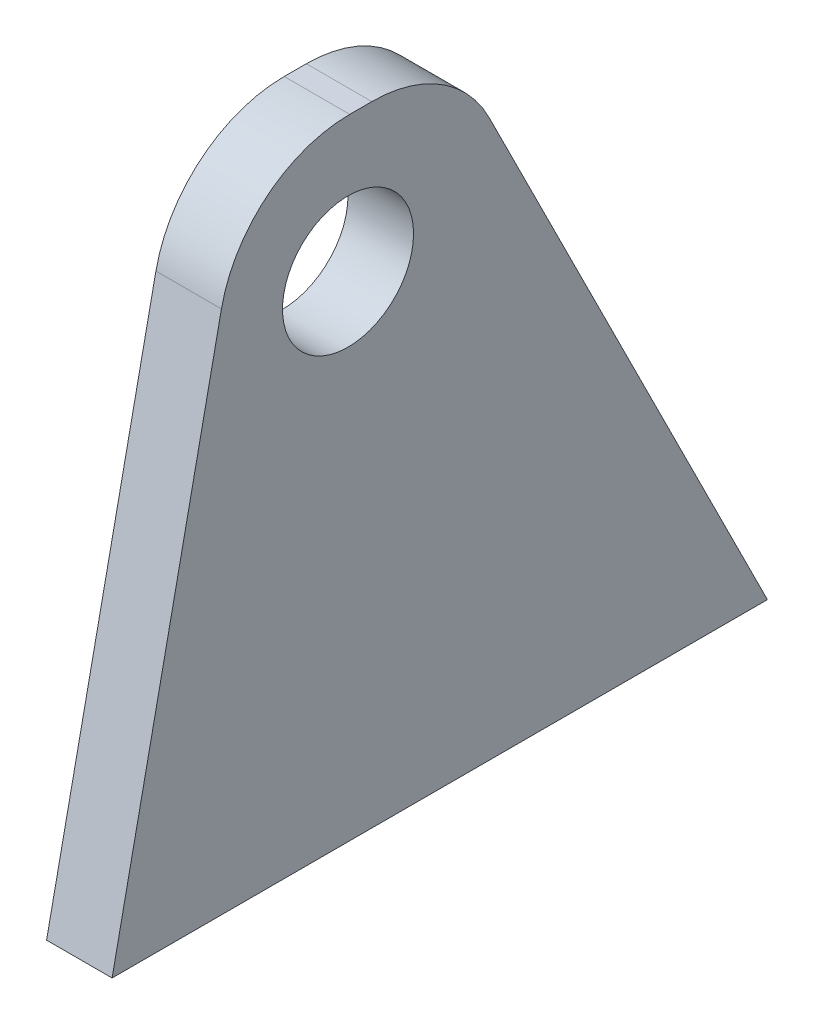
ISO-10303-21;
HEADER;
FILE_DESCRIPTION(('STEP AP214'),'2;1');
FILE_NAME('part.step','',(''),(''),'','','');
FILE_SCHEMA(('AUTOMOTIVE_DESIGN { 1 0 10303 214 1 1 1 1 }'));
ENDSEC;
DATA;
#1=APPLICATION_CONTEXT('core data for automotive mechanical design processes');
#2=APPLICATION_PROTOCOL_DEFINITION('international standard','automotive_design',2000,#1);
#3=PRODUCT_CONTEXT('',#1,'mechanical');
#4=PRODUCT('Part','Part','',(#3));
#5=PRODUCT_RELATED_PRODUCT_CATEGORY('part','',(#4));
#6=PRODUCT_DEFINITION_FORMATION('','',#4);
#7=PRODUCT_DEFINITION_CONTEXT('part definition',#1,'design');
#8=PRODUCT_DEFINITION('design','',#6,#7);
#9=PRODUCT_DEFINITION_SHAPE('','',#8);
#10=(LENGTH_UNIT() NAMED_UNIT(*) SI_UNIT(.MILLI.,.METRE.));
#11=(NAMED_UNIT(*) PLANE_ANGLE_UNIT() SI_UNIT($,.RADIAN.));
#12=(NAMED_UNIT(*) SI_UNIT($,.STERADIAN.) SOLID_ANGLE_UNIT());
#13=UNCERTAINTY_MEASURE_WITH_UNIT(LENGTH_MEASURE(1.E-05),#10,'distance_accuracy_value','');
#14=(GEOMETRIC_REPRESENTATION_CONTEXT(3) GLOBAL_UNCERTAINTY_ASSIGNED_CONTEXT((#13)) GLOBAL_UNIT_ASSIGNED_CONTEXT((#10,
#11,#12)) REPRESENTATION_CONTEXT('',''));
#15=CARTESIAN_POINT('',(0.,0.,0.));
#16=DIRECTION('',(0.,0.,1.));
#17=DIRECTION('',(1.,0.,0.));
#18=AXIS2_PLACEMENT_3D('',#15,#16,#17);
#19=CARTESIAN_POINT('',(3.175,0.,0.));
#20=DIRECTION('',(-1.,0.,0.));
#21=DIRECTION('',(0.,0.,1.));
#22=AXIS2_PLACEMENT_3D('',#19,#20,#21);
#23=PLANE('',#22);
#24=DIRECTION('',(0.,0.894427190999916,0.447213595499958));
#25=VECTOR('',#24,1.);
#26=CARTESIAN_POINT('',(3.175,0.,-31.75));
#27=LINE('',#26,#25);
#28=CARTESIAN_POINT('',(3.175,0.,-31.75));
#29=VERTEX_POINT('',#28);
#30=CARTESIAN_POINT('',(3.175,26.9698063314247,-18.2650968342876));
#31=VERTEX_POINT('',#30);
#32=EDGE_CURVE('E92',#29,#31,#27,.T.);
#33=ORIENTED_EDGE('',*,*,#32,.T.);
#34=CARTESIAN_POINT('',(3.175,24.13,-12.5854841714382));
#35=DIRECTION('',(-1.,0.,0.));
#36=DIRECTION('',(0.,0.,1.));
#37=AXIS2_PLACEMENT_3D('',#34,#35,#36);
#38=CIRCLE('',#37,6.35);
#39=CARTESIAN_POINT('',(3.175,30.48,-12.5854841714382));
#40=VERTEX_POINT('',#39);
#41=EDGE_CURVE('E47',#31,#40,#38,.F.);
#42=ORIENTED_EDGE('',*,*,#41,.T.);
#43=DIRECTION('',(0.,0.,1.));
#44=VECTOR('',#43,1.);
#45=CARTESIAN_POINT('',(3.175,30.48,-16.51));
#46=LINE('',#45,#44);
#47=CARTESIAN_POINT('',(3.175,30.48,-11.5134234806695));
#48=VERTEX_POINT('',#47);
#49=EDGE_CURVE('E99',#40,#48,#46,.T.);
#50=ORIENTED_EDGE('',*,*,#49,.T.);
#51=CARTESIAN_POINT('',(3.175,24.13,-11.5134234806695));
#52=DIRECTION('',(-1.,0.,0.));
#53=DIRECTION('',(0.,0.,1.));
#54=AXIS2_PLACEMENT_3D('',#51,#52,#53);
#55=CIRCLE('',#54,6.35);
#56=CARTESIAN_POINT('',(3.175,25.4251095136112,-5.29689781533567));
#57=VERTEX_POINT('',#56);
#58=EDGE_CURVE('E54',#48,#57,#55,.F.);
#59=ORIENTED_EDGE('',*,*,#58,.T.);
#60=DIRECTION('',(0.,-0.978980419737605,0.203954254112001));
#61=VECTOR('',#60,1.);
#62=CARTESIAN_POINT('',(3.175,30.48,-6.35));
#63=LINE('',#62,#61);
#64=CARTESIAN_POINT('',(3.175,0.,0.));
#65=VERTEX_POINT('',#64);
#66=EDGE_CURVE('E104',#57,#65,#63,.T.);
#67=ORIENTED_EDGE('',*,*,#66,.T.);
#68=DIRECTION('',(0.,0.,-1.));
#69=VECTOR('',#68,1.);
#70=CARTESIAN_POINT('',(3.175,0.,0.));
#71=LINE('',#70,#69);
#72=EDGE_CURVE('E100',#65,#29,#71,.T.);
#73=ORIENTED_EDGE('',*,*,#72,.T.);
#74=EDGE_LOOP('',(#33,#42,#50,#59,#67,#73));
#75=FACE_BOUND('',#74,.T.);
#76=CARTESIAN_POINT('',(3.175,23.92807,-11.43));
#77=DIRECTION('',(1.,0.,0.));
#78=DIRECTION('',(0.,0.,-1.));
#79=AXIS2_PLACEMENT_3D('',#76,#77,#78);
#80=CIRCLE('',#79,3.175);
#81=CARTESIAN_POINT('',(3.175,23.92807,-14.605));
#82=VERTEX_POINT('',#81);
#83=EDGE_CURVE('E145',#82,#82,#80,.T.);
#84=ORIENTED_EDGE('',*,*,#83,.F.);
#85=EDGE_LOOP('',(#84));
#86=FACE_BOUND('',#85,.T.);
#87=ADVANCED_FACE('F39',(#75,#86),#23,.F.);
#88=CARTESIAN_POINT('',(0.,0.,0.));
#89=DIRECTION('',(-1.,0.,0.));
#90=DIRECTION('',(0.,0.,1.));
#91=AXIS2_PLACEMENT_3D('',#88,#89,#90);
#92=PLANE('',#91);
#93=DIRECTION('',(0.,0.,1.));
#94=VECTOR('',#93,1.);
#95=CARTESIAN_POINT('',(0.,30.48,-16.51));
#96=LINE('',#95,#94);
#97=CARTESIAN_POINT('',(0.,30.48,-12.5854841714382));
#98=VERTEX_POINT('',#97);
#99=CARTESIAN_POINT('',(0.,30.48,-11.5134234806695));
#100=VERTEX_POINT('',#99);
#101=EDGE_CURVE('E142',#98,#100,#96,.T.);
#102=ORIENTED_EDGE('',*,*,#101,.F.);
#103=CARTESIAN_POINT('',(0.,24.13,-12.5854841714382));
#104=DIRECTION('',(-1.,0.,0.));
#105=DIRECTION('',(0.,0.,1.));
#106=AXIS2_PLACEMENT_3D('',#103,#104,#105);
#107=CIRCLE('',#106,6.35);
#108=CARTESIAN_POINT('',(0.,26.9698063314247,-18.2650968342876));
#109=VERTEX_POINT('',#108);
#110=EDGE_CURVE('E125',#98,#109,#107,.T.);
#111=ORIENTED_EDGE('',*,*,#110,.T.);
#112=DIRECTION('',(0.,0.894427190999916,0.447213595499958));
#113=VECTOR('',#112,1.);
#114=CARTESIAN_POINT('',(0.,0.,-31.75));
#115=LINE('',#114,#113);
#116=CARTESIAN_POINT('',(0.,0.,-31.75));
#117=VERTEX_POINT('',#116);
#118=EDGE_CURVE('E141',#117,#109,#115,.T.);
#119=ORIENTED_EDGE('',*,*,#118,.F.);
#120=DIRECTION('',(0.,0.,-1.));
#121=VECTOR('',#120,1.);
#122=CARTESIAN_POINT('',(0.,0.,0.));
#123=LINE('',#122,#121);
#124=CARTESIAN_POINT('',(0.,0.,0.));
#125=VERTEX_POINT('',#124);
#126=EDGE_CURVE('E112',#125,#117,#123,.T.);
#127=ORIENTED_EDGE('',*,*,#126,.F.);
#128=DIRECTION('',(0.,-0.978980419737605,0.203954254112001));
#129=VECTOR('',#128,1.);
#130=CARTESIAN_POINT('',(0.,30.48,-6.35));
#131=LINE('',#130,#129);
#132=CARTESIAN_POINT('',(0.,25.4251095136112,-5.29689781533567));
#133=VERTEX_POINT('',#132);
#134=EDGE_CURVE('E108',#133,#125,#131,.T.);
#135=ORIENTED_EDGE('',*,*,#134,.F.);
#136=CARTESIAN_POINT('',(0.,24.13,-11.5134234806695));
#137=DIRECTION('',(-1.,0.,0.));
#138=DIRECTION('',(0.,0.,1.));
#139=AXIS2_PLACEMENT_3D('',#136,#137,#138);
#140=CIRCLE('',#139,6.35);
#141=EDGE_CURVE('E123',#133,#100,#140,.T.);
#142=ORIENTED_EDGE('',*,*,#141,.T.);
#143=EDGE_LOOP('',(#102,#111,#119,#127,#135,#142));
#144=FACE_BOUND('',#143,.T.);
#145=CARTESIAN_POINT('',(0.,23.92807,-11.43));
#146=DIRECTION('',(1.,0.,0.));
#147=DIRECTION('',(0.,0.,-1.));
#148=AXIS2_PLACEMENT_3D('',#145,#146,#147);
#149=CIRCLE('',#148,3.175);
#150=CARTESIAN_POINT('',(0.,23.92807,-14.605));
#151=VERTEX_POINT('',#150);
#152=EDGE_CURVE('E230',#151,#151,#149,.T.);
#153=ORIENTED_EDGE('',*,*,#152,.T.);
#154=EDGE_LOOP('',(#153));
#155=FACE_BOUND('',#154,.T.);
#156=ADVANCED_FACE('F139',(#144,#155),#92,.T.);
#157=CARTESIAN_POINT('',(3.175,0.,0.));
#158=DIRECTION('',(0.,1.,0.));
#159=DIRECTION('',(0.,0.,1.));
#160=AXIS2_PLACEMENT_3D('',#157,#158,#159);
#161=PLANE('',#160);
#162=ORIENTED_EDGE('',*,*,#126,.T.);
#163=DIRECTION('',(-1.,0.,0.));
#164=VECTOR('',#163,1.);
#165=CARTESIAN_POINT('',(3.175,0.,-31.75));
#166=LINE('',#165,#164);
#167=EDGE_CURVE('E96',#29,#117,#166,.T.);
#168=ORIENTED_EDGE('',*,*,#167,.F.);
#169=ORIENTED_EDGE('',*,*,#72,.F.);
#170=DIRECTION('',(-1.,0.,0.));
#171=VECTOR('',#170,1.);
#172=CARTESIAN_POINT('',(3.175,0.,0.));
#173=LINE('',#172,#171);
#174=EDGE_CURVE('E114',#65,#125,#173,.T.);
#175=ORIENTED_EDGE('',*,*,#174,.T.);
#176=EDGE_LOOP('',(#162,#168,#169,#175));
#177=FACE_BOUND('',#176,.T.);
#178=ADVANCED_FACE('F110',(#177),#161,.F.);
#179=CARTESIAN_POINT('',(3.175,0.,-31.75));
#180=DIRECTION('',(0.,-0.447213595499958,0.894427190999916));
#181=DIRECTION('',(0.,-0.894427190999916,-0.447213595499958));
#182=AXIS2_PLACEMENT_3D('',#179,#180,#181);
#183=PLANE('',#182);
#184=ORIENTED_EDGE('',*,*,#118,.T.);
#185=DIRECTION('',(-1.,0.,0.));
#186=VECTOR('',#185,1.);
#187=CARTESIAN_POINT('',(3.175,26.9698063314247,-18.2650968342876));
#188=LINE('',#187,#186);
#189=EDGE_CURVE('E62',#109,#31,#188,.F.);
#190=ORIENTED_EDGE('',*,*,#189,.T.);
#191=ORIENTED_EDGE('',*,*,#32,.F.);
#192=ORIENTED_EDGE('',*,*,#167,.T.);
#193=EDGE_LOOP('',(#184,#190,#191,#192));
#194=FACE_BOUND('',#193,.T.);
#195=ADVANCED_FACE('F94',(#194),#183,.F.);
#196=CARTESIAN_POINT('',(3.175,30.48,-16.51));
#197=DIRECTION('',(0.,-1.,0.));
#198=DIRECTION('',(0.,0.,-1.));
#199=AXIS2_PLACEMENT_3D('',#196,#197,#198);
#200=PLANE('',#199);
#201=ORIENTED_EDGE('',*,*,#49,.F.);
#202=DIRECTION('',(-1.,0.,0.));
#203=VECTOR('',#202,1.);
#204=CARTESIAN_POINT('',(3.175,30.48,-12.5854841714382));
#205=LINE('',#204,#203);
#206=EDGE_CURVE('E116',#40,#98,#205,.T.);
#207=ORIENTED_EDGE('',*,*,#206,.T.);
#208=ORIENTED_EDGE('',*,*,#101,.T.);
#209=DIRECTION('',(-1.,0.,0.));
#210=VECTOR('',#209,1.);
#211=CARTESIAN_POINT('',(3.175,30.48,-11.5134234806695));
#212=LINE('',#211,#210);
#213=EDGE_CURVE('E113',#100,#48,#212,.F.);
#214=ORIENTED_EDGE('',*,*,#213,.T.);
#215=EDGE_LOOP('',(#201,#207,#208,#214));
#216=FACE_BOUND('',#215,.T.);
#217=ADVANCED_FACE('F132',(#216),#200,.F.);
#218=CARTESIAN_POINT('',(3.175,30.48,-6.35));
#219=DIRECTION('',(0.,-0.203954254112001,-0.978980419737605));
#220=DIRECTION('',(0.,0.978980419737605,-0.203954254112001));
#221=AXIS2_PLACEMENT_3D('',#218,#219,#220);
#222=PLANE('',#221);
#223=ORIENTED_EDGE('',*,*,#66,.F.);
#224=DIRECTION('',(-1.,0.,0.));
#225=VECTOR('',#224,1.);
#226=CARTESIAN_POINT('',(3.175,25.4251095136112,-5.29689781533567));
#227=LINE('',#226,#225);
#228=EDGE_CURVE('E11',#57,#133,#227,.T.);
#229=ORIENTED_EDGE('',*,*,#228,.T.);
#230=ORIENTED_EDGE('',*,*,#134,.T.);
#231=ORIENTED_EDGE('',*,*,#174,.F.);
#232=EDGE_LOOP('',(#223,#229,#230,#231));
#233=FACE_BOUND('',#232,.T.);
#234=ADVANCED_FACE('F150',(#233),#222,.F.);
#235=CARTESIAN_POINT('',(3.175,23.92807,-11.43));
#236=DIRECTION('',(-1.,0.,0.));
#237=DIRECTION('',(0.,0.,1.));
#238=AXIS2_PLACEMENT_3D('',#235,#236,#237);
#239=CYLINDRICAL_SURFACE('',#238,3.175);
#240=ORIENTED_EDGE('',*,*,#83,.T.);
#241=EDGE_LOOP('',(#240));
#242=FACE_BOUND('',#241,.T.);
#243=ORIENTED_EDGE('',*,*,#152,.F.);
#244=EDGE_LOOP('',(#243));
#245=FACE_BOUND('',#244,.T.);
#246=ADVANCED_FACE('F157',(#242,#245),#239,.F.);
#247=CARTESIAN_POINT('',(3.175,24.13,-12.5854841714382));
#248=DIRECTION('',(-1.,0.,0.));
#249=DIRECTION('',(0.,0.,1.));
#250=AXIS2_PLACEMENT_3D('',#247,#248,#249);
#251=CYLINDRICAL_SURFACE('',#250,6.35);
#252=ORIENTED_EDGE('',*,*,#41,.F.);
#253=ORIENTED_EDGE('',*,*,#189,.F.);
#254=ORIENTED_EDGE('',*,*,#110,.F.);
#255=ORIENTED_EDGE('',*,*,#206,.F.);
#256=EDGE_LOOP('',(#252,#253,#254,#255));
#257=FACE_BOUND('',#256,.T.);
#258=ADVANCED_FACE('F137',(#257),#251,.T.);
#259=CARTESIAN_POINT('',(3.175,24.13,-11.5134234806695));
#260=DIRECTION('',(-1.,0.,0.));
#261=DIRECTION('',(0.,0.,1.));
#262=AXIS2_PLACEMENT_3D('',#259,#260,#261);
#263=CYLINDRICAL_SURFACE('',#262,6.35);
#264=ORIENTED_EDGE('',*,*,#58,.F.);
#265=ORIENTED_EDGE('',*,*,#213,.F.);
#266=ORIENTED_EDGE('',*,*,#141,.F.);
#267=ORIENTED_EDGE('',*,*,#228,.F.);
#268=EDGE_LOOP('',(#264,#265,#266,#267));
#269=FACE_BOUND('',#268,.T.);
#270=ADVANCED_FACE('F41',(#269),#263,.T.);
#271=CLOSED_SHELL('',(#87,#156,#178,#195,#217,#234,#246,#258,#270));
#272=MANIFOLD_SOLID_BREP('B2',#271);
#273=ADVANCED_BREP_SHAPE_REPRESENTATION('',(#18,#272),#14);
#274=SHAPE_DEFINITION_REPRESENTATION(#9,#273);
ENDSEC;
END-ISO-10303-21;
